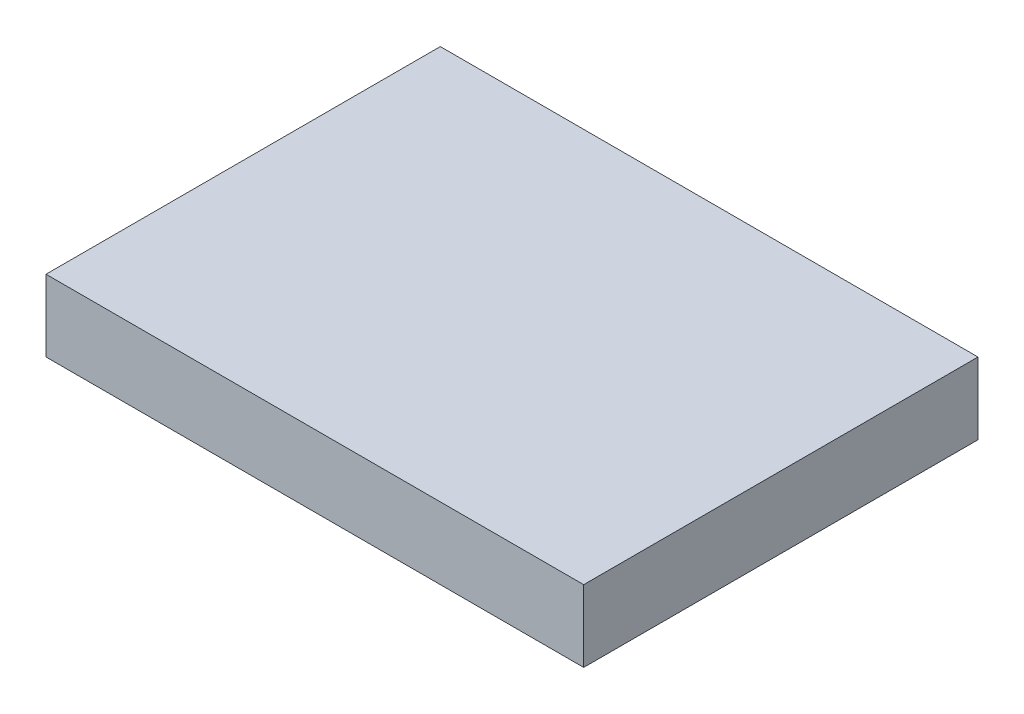
ISO-10303-21;
HEADER;
FILE_DESCRIPTION(('STEP AP214'),'2;1');
FILE_NAME('part.step','',(''),(''),'','','');
FILE_SCHEMA(('AUTOMOTIVE_DESIGN { 1 0 10303 214 1 1 1 1 }'));
ENDSEC;
DATA;
#1=APPLICATION_CONTEXT('core data for automotive mechanical design processes');
#2=APPLICATION_PROTOCOL_DEFINITION('international standard','automotive_design',2000,#1);
#3=PRODUCT_CONTEXT('',#1,'mechanical');
#4=PRODUCT('Part','Part','',(#3));
#5=PRODUCT_RELATED_PRODUCT_CATEGORY('part','',(#4));
#6=PRODUCT_DEFINITION_FORMATION('','',#4);
#7=PRODUCT_DEFINITION_CONTEXT('part definition',#1,'design');
#8=PRODUCT_DEFINITION('design','',#6,#7);
#9=PRODUCT_DEFINITION_SHAPE('','',#8);
#10=(LENGTH_UNIT() NAMED_UNIT(*) SI_UNIT(.MILLI.,.METRE.));
#11=(NAMED_UNIT(*) PLANE_ANGLE_UNIT() SI_UNIT($,.RADIAN.));
#12=(NAMED_UNIT(*) SI_UNIT($,.STERADIAN.) SOLID_ANGLE_UNIT());
#13=UNCERTAINTY_MEASURE_WITH_UNIT(LENGTH_MEASURE(1.E-05),#10,'distance_accuracy_value','');
#14=(GEOMETRIC_REPRESENTATION_CONTEXT(3) GLOBAL_UNCERTAINTY_ASSIGNED_CONTEXT((#13)) GLOBAL_UNIT_ASSIGNED_CONTEXT((#10,
#11,#12)) REPRESENTATION_CONTEXT('',''));
#15=CARTESIAN_POINT('',(0.,0.,0.));
#16=DIRECTION('',(0.,0.,1.));
#17=DIRECTION('',(1.,0.,0.));
#18=AXIS2_PLACEMENT_3D('',#15,#16,#17);
#19=CARTESIAN_POINT('',(37.5,10.,27.5));
#20=DIRECTION('',(-1.,0.,0.));
#21=DIRECTION('',(0.,0.,1.));
#22=AXIS2_PLACEMENT_3D('',#19,#20,#21);
#23=PLANE('',#22);
#24=DIRECTION('',(0.,0.,-1.));
#25=VECTOR('',#24,1.);
#26=CARTESIAN_POINT('',(37.5,0.,27.5));
#27=LINE('',#26,#25);
#28=CARTESIAN_POINT('',(37.5,0.,27.5));
#29=VERTEX_POINT('',#28);
#30=CARTESIAN_POINT('',(37.5,0.,-27.5));
#31=VERTEX_POINT('',#30);
#32=EDGE_CURVE('E96',#29,#31,#27,.T.);
#33=ORIENTED_EDGE('',*,*,#32,.T.);
#34=DIRECTION('',(0.,-1.,0.));
#35=VECTOR('',#34,1.);
#36=CARTESIAN_POINT('',(37.5,10.,-27.5));
#37=LINE('',#36,#35);
#38=CARTESIAN_POINT('',(37.5,10.,-27.5));
#39=VERTEX_POINT('',#38);
#40=EDGE_CURVE('E11',#39,#31,#37,.T.);
#41=ORIENTED_EDGE('',*,*,#40,.F.);
#42=DIRECTION('',(0.,0.,-1.));
#43=VECTOR('',#42,1.);
#44=CARTESIAN_POINT('',(37.5,10.,27.5));
#45=LINE('',#44,#43);
#46=CARTESIAN_POINT('',(37.5,10.,27.5));
#47=VERTEX_POINT('',#46);
#48=EDGE_CURVE('E84',#47,#39,#45,.T.);
#49=ORIENTED_EDGE('',*,*,#48,.F.);
#50=DIRECTION('',(0.,-1.,0.));
#51=VECTOR('',#50,1.);
#52=CARTESIAN_POINT('',(37.5,10.,27.5));
#53=LINE('',#52,#51);
#54=EDGE_CURVE('E92',#47,#29,#53,.T.);
#55=ORIENTED_EDGE('',*,*,#54,.T.);
#56=EDGE_LOOP('',(#33,#41,#49,#55));
#57=FACE_BOUND('',#56,.T.);
#58=ADVANCED_FACE('F33',(#57),#23,.F.);
#59=CARTESIAN_POINT('',(-37.5,10.,-27.5));
#60=DIRECTION('',(0.,0.,1.));
#61=DIRECTION('',(1.,0.,0.));
#62=AXIS2_PLACEMENT_3D('',#59,#60,#61);
#63=PLANE('',#62);
#64=DIRECTION('',(-1.,0.,0.));
#65=VECTOR('',#64,1.);
#66=CARTESIAN_POINT('',(-37.5,0.,-27.5));
#67=LINE('',#66,#65);
#68=CARTESIAN_POINT('',(-37.5,0.,-27.5));
#69=VERTEX_POINT('',#68);
#70=EDGE_CURVE('E88',#31,#69,#67,.T.);
#71=ORIENTED_EDGE('',*,*,#70,.T.);
#72=DIRECTION('',(0.,-1.,0.));
#73=VECTOR('',#72,1.);
#74=CARTESIAN_POINT('',(-37.5,10.,-27.5));
#75=LINE('',#74,#73);
#76=CARTESIAN_POINT('',(-37.5,10.,-27.5));
#77=VERTEX_POINT('',#76);
#78=EDGE_CURVE('E41',#77,#69,#75,.T.);
#79=ORIENTED_EDGE('',*,*,#78,.F.);
#80=DIRECTION('',(-1.,0.,0.));
#81=VECTOR('',#80,1.);
#82=CARTESIAN_POINT('',(-37.5,10.,-27.5));
#83=LINE('',#82,#81);
#84=EDGE_CURVE('E79',#39,#77,#83,.T.);
#85=ORIENTED_EDGE('',*,*,#84,.F.);
#86=ORIENTED_EDGE('',*,*,#40,.T.);
#87=EDGE_LOOP('',(#71,#79,#85,#86));
#88=FACE_BOUND('',#87,.T.);
#89=ADVANCED_FACE('F87',(#88),#63,.F.);
#90=CARTESIAN_POINT('',(-37.5,10.,27.5));
#91=DIRECTION('',(1.,0.,0.));
#92=DIRECTION('',(0.,0.,-1.));
#93=AXIS2_PLACEMENT_3D('',#90,#91,#92);
#94=PLANE('',#93);
#95=DIRECTION('',(0.,0.,1.));
#96=VECTOR('',#95,1.);
#97=CARTESIAN_POINT('',(-37.5,0.,27.5));
#98=LINE('',#97,#96);
#99=CARTESIAN_POINT('',(-37.5,0.,27.5));
#100=VERTEX_POINT('',#99);
#101=EDGE_CURVE('E66',#69,#100,#98,.T.);
#102=ORIENTED_EDGE('',*,*,#101,.T.);
#103=DIRECTION('',(0.,-1.,0.));
#104=VECTOR('',#103,1.);
#105=CARTESIAN_POINT('',(-37.5,10.,27.5));
#106=LINE('',#105,#104);
#107=CARTESIAN_POINT('',(-37.5,10.,27.5));
#108=VERTEX_POINT('',#107);
#109=EDGE_CURVE('E89',#108,#100,#106,.T.);
#110=ORIENTED_EDGE('',*,*,#109,.F.);
#111=DIRECTION('',(0.,0.,1.));
#112=VECTOR('',#111,1.);
#113=CARTESIAN_POINT('',(-37.5,10.,27.5));
#114=LINE('',#113,#112);
#115=EDGE_CURVE('E82',#77,#108,#114,.T.);
#116=ORIENTED_EDGE('',*,*,#115,.F.);
#117=ORIENTED_EDGE('',*,*,#78,.T.);
#118=EDGE_LOOP('',(#102,#110,#116,#117));
#119=FACE_BOUND('',#118,.T.);
#120=ADVANCED_FACE('F90',(#119),#94,.F.);
#121=CARTESIAN_POINT('',(-37.5,10.,27.5));
#122=DIRECTION('',(0.,0.,-1.));
#123=DIRECTION('',(-1.,0.,0.));
#124=AXIS2_PLACEMENT_3D('',#121,#122,#123);
#125=PLANE('',#124);
#126=DIRECTION('',(1.,0.,0.));
#127=VECTOR('',#126,1.);
#128=CARTESIAN_POINT('',(-37.5,0.,27.5));
#129=LINE('',#128,#127);
#130=EDGE_CURVE('E72',#100,#29,#129,.T.);
#131=ORIENTED_EDGE('',*,*,#130,.T.);
#132=ORIENTED_EDGE('',*,*,#54,.F.);
#133=DIRECTION('',(1.,0.,0.));
#134=VECTOR('',#133,1.);
#135=CARTESIAN_POINT('',(-37.5,10.,27.5));
#136=LINE('',#135,#134);
#137=EDGE_CURVE('E49',#108,#47,#136,.T.);
#138=ORIENTED_EDGE('',*,*,#137,.F.);
#139=ORIENTED_EDGE('',*,*,#109,.T.);
#140=EDGE_LOOP('',(#131,#132,#138,#139));
#141=FACE_BOUND('',#140,.T.);
#142=ADVANCED_FACE('F103',(#141),#125,.F.);
#143=CARTESIAN_POINT('',(0.,10.,0.));
#144=DIRECTION('',(0.,-1.,0.));
#145=DIRECTION('',(0.,0.,-1.));
#146=AXIS2_PLACEMENT_3D('',#143,#144,#145);
#147=PLANE('',#146);
#148=ORIENTED_EDGE('',*,*,#48,.T.);
#149=ORIENTED_EDGE('',*,*,#84,.T.);
#150=ORIENTED_EDGE('',*,*,#115,.T.);
#151=ORIENTED_EDGE('',*,*,#137,.T.);
#152=EDGE_LOOP('',(#148,#149,#150,#151));
#153=FACE_BOUND('',#152,.T.);
#154=ADVANCED_FACE('F80',(#153),#147,.F.);
#155=CARTESIAN_POINT('',(0.,0.,0.));
#156=DIRECTION('',(0.,-1.,0.));
#157=DIRECTION('',(0.,0.,-1.));
#158=AXIS2_PLACEMENT_3D('',#155,#156,#157);
#159=PLANE('',#158);
#160=ORIENTED_EDGE('',*,*,#32,.F.);
#161=ORIENTED_EDGE('',*,*,#130,.F.);
#162=ORIENTED_EDGE('',*,*,#101,.F.);
#163=ORIENTED_EDGE('',*,*,#70,.F.);
#164=EDGE_LOOP('',(#160,#161,#162,#163));
#165=FACE_BOUND('',#164,.T.);
#166=ADVANCED_FACE('F106',(#165),#159,.T.);
#167=CLOSED_SHELL('',(#58,#89,#120,#142,#154,#166));
#168=MANIFOLD_SOLID_BREP('B2',#167);
#169=ADVANCED_BREP_SHAPE_REPRESENTATION('',(#18,#168),#14);
#170=SHAPE_DEFINITION_REPRESENTATION(#9,#169);
ENDSEC;
END-ISO-10303-21;
